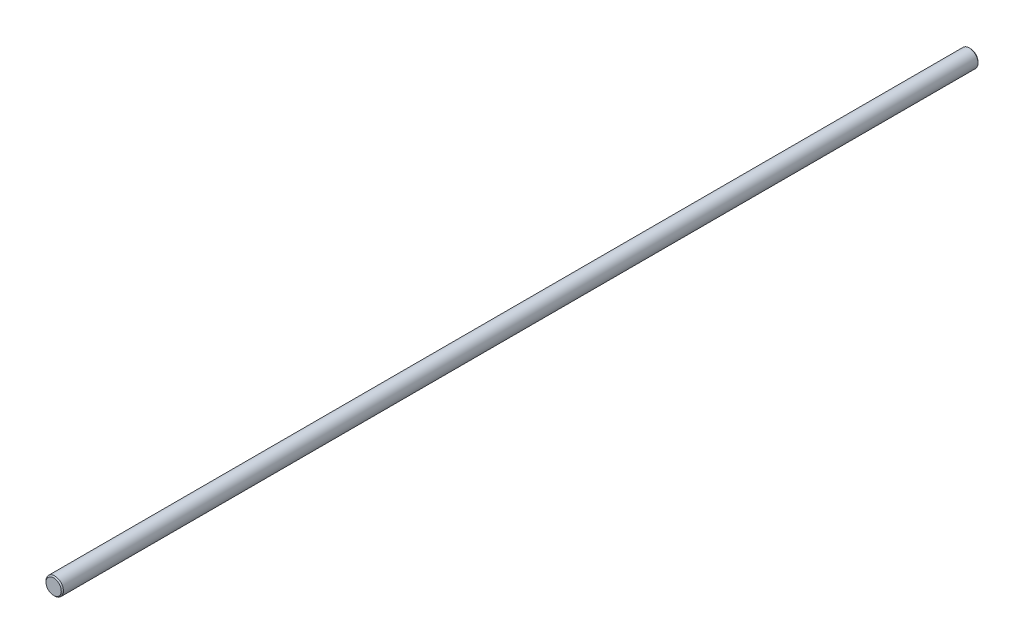
ISO-10303-21;
HEADER;
FILE_DESCRIPTION(('STEP AP214'),'2;1');
FILE_NAME('part.step','',(''),(''),'','','');
FILE_SCHEMA(('AUTOMOTIVE_DESIGN { 1 0 10303 214 1 1 1 1 }'));
ENDSEC;
DATA;
#1=APPLICATION_CONTEXT('core data for automotive mechanical design processes');
#2=APPLICATION_PROTOCOL_DEFINITION('international standard','automotive_design',2000,#1);
#3=PRODUCT_CONTEXT('',#1,'mechanical');
#4=PRODUCT('Part','Part','',(#3));
#5=PRODUCT_RELATED_PRODUCT_CATEGORY('part','',(#4));
#6=PRODUCT_DEFINITION_FORMATION('','',#4);
#7=PRODUCT_DEFINITION_CONTEXT('part definition',#1,'design');
#8=PRODUCT_DEFINITION('design','',#6,#7);
#9=PRODUCT_DEFINITION_SHAPE('','',#8);
#10=(LENGTH_UNIT() NAMED_UNIT(*) SI_UNIT(.MILLI.,.METRE.));
#11=(NAMED_UNIT(*) PLANE_ANGLE_UNIT() SI_UNIT($,.RADIAN.));
#12=(NAMED_UNIT(*) SI_UNIT($,.STERADIAN.) SOLID_ANGLE_UNIT());
#13=UNCERTAINTY_MEASURE_WITH_UNIT(LENGTH_MEASURE(1.E-05),#10,'distance_accuracy_value','');
#14=(GEOMETRIC_REPRESENTATION_CONTEXT(3) GLOBAL_UNCERTAINTY_ASSIGNED_CONTEXT((#13)) GLOBAL_UNIT_ASSIGNED_CONTEXT((#10,
#11,#12)) REPRESENTATION_CONTEXT('',''));
#15=CARTESIAN_POINT('',(0.,0.,0.));
#16=DIRECTION('',(0.,0.,1.));
#17=DIRECTION('',(1.,0.,0.));
#18=AXIS2_PLACEMENT_3D('',#15,#16,#17);
#19=CARTESIAN_POINT('',(0.,0.,420.));
#20=DIRECTION('',(0.,0.,-1.));
#21=DIRECTION('',(-1.,0.,0.));
#22=AXIS2_PLACEMENT_3D('',#19,#20,#21);
#23=CYLINDRICAL_SURFACE('',#22,4.);
#24=CARTESIAN_POINT('',(0.,0.,419.5));
#25=DIRECTION('',(0.,0.,1.));
#26=DIRECTION('',(1.,0.,0.));
#27=AXIS2_PLACEMENT_3D('',#24,#25,#26);
#28=CIRCLE('',#27,4.);
#29=CARTESIAN_POINT('',(4.,0.,419.5));
#30=VERTEX_POINT('',#29);
#31=EDGE_CURVE('E45',#30,#30,#28,.F.);
#32=ORIENTED_EDGE('',*,*,#31,.T.);
#33=EDGE_LOOP('',(#32));
#34=FACE_BOUND('',#33,.T.);
#35=CARTESIAN_POINT('',(0.,0.,0.500000000000111));
#36=DIRECTION('',(0.,0.,1.));
#37=DIRECTION('',(1.,0.,0.));
#38=AXIS2_PLACEMENT_3D('',#35,#36,#37);
#39=CIRCLE('',#38,4.);
#40=CARTESIAN_POINT('',(4.,0.,0.500000000000111));
#41=VERTEX_POINT('',#40);
#42=EDGE_CURVE('E50',#41,#41,#39,.T.);
#43=ORIENTED_EDGE('',*,*,#42,.T.);
#44=EDGE_LOOP('',(#43));
#45=FACE_BOUND('',#44,.T.);
#46=ADVANCED_FACE('F37',(#34,#45),#23,.T.);
#47=CARTESIAN_POINT('',(0.,0.,420.));
#48=DIRECTION('',(0.,0.,1.));
#49=DIRECTION('',(1.,0.,0.));
#50=AXIS2_PLACEMENT_3D('',#47,#48,#49);
#51=PLANE('',#50);
#52=CARTESIAN_POINT('',(0.,0.,420.));
#53=DIRECTION('',(0.,0.,1.));
#54=DIRECTION('',(1.,0.,0.));
#55=AXIS2_PLACEMENT_3D('',#52,#53,#54);
#56=CIRCLE('',#55,3.5);
#57=CARTESIAN_POINT('',(3.5,0.,420.));
#58=VERTEX_POINT('',#57);
#59=EDGE_CURVE('E55',#58,#58,#56,.T.);
#60=ORIENTED_EDGE('',*,*,#59,.T.);
#61=EDGE_LOOP('',(#60));
#62=FACE_BOUND('',#61,.T.);
#63=ADVANCED_FACE('F62',(#62),#51,.T.);
#64=CARTESIAN_POINT('',(0.,0.,0.));
#65=DIRECTION('',(0.,0.,1.));
#66=DIRECTION('',(1.,0.,0.));
#67=AXIS2_PLACEMENT_3D('',#64,#65,#66);
#68=PLANE('',#67);
#69=CARTESIAN_POINT('',(0.,0.,0.));
#70=DIRECTION('',(0.,0.,1.));
#71=DIRECTION('',(1.,0.,0.));
#72=AXIS2_PLACEMENT_3D('',#69,#70,#71);
#73=CIRCLE('',#72,3.49999999999995);
#74=CARTESIAN_POINT('',(3.49999999999995,0.,0.));
#75=VERTEX_POINT('',#74);
#76=EDGE_CURVE('E10',#75,#75,#73,.F.);
#77=ORIENTED_EDGE('',*,*,#76,.T.);
#78=EDGE_LOOP('',(#77));
#79=FACE_BOUND('',#78,.T.);
#80=ADVANCED_FACE('F66',(#79),#68,.F.);
#81=CARTESIAN_POINT('',(0.,0.,420.));
#82=DIRECTION('',(0.,0.,-1.));
#83=DIRECTION('',(-1.,0.,0.));
#84=AXIS2_PLACEMENT_3D('',#81,#82,#83);
#85=CONICAL_SURFACE('',#84,3.5,0.785398163397445);
#86=ORIENTED_EDGE('',*,*,#31,.F.);
#87=EDGE_LOOP('',(#86));
#88=FACE_BOUND('',#87,.T.);
#89=ORIENTED_EDGE('',*,*,#59,.F.);
#90=EDGE_LOOP('',(#89));
#91=FACE_BOUND('',#90,.T.);
#92=ADVANCED_FACE('F64',(#88,#91),#85,.T.);
#93=CARTESIAN_POINT('',(0.,0.,0.500000000000111));
#94=DIRECTION('',(0.,0.,1.));
#95=DIRECTION('',(1.,0.,0.));
#96=AXIS2_PLACEMENT_3D('',#93,#94,#95);
#97=CONICAL_SURFACE('',#96,4.,0.785398163397389);
#98=ORIENTED_EDGE('',*,*,#76,.F.);
#99=EDGE_LOOP('',(#98));
#100=FACE_BOUND('',#99,.T.);
#101=ORIENTED_EDGE('',*,*,#42,.F.);
#102=EDGE_LOOP('',(#101));
#103=FACE_BOUND('',#102,.T.);
#104=ADVANCED_FACE('F39',(#100,#103),#97,.T.);
#105=CLOSED_SHELL('',(#46,#63,#80,#92,#104));
#106=MANIFOLD_SOLID_BREP('B2',#105);
#107=ADVANCED_BREP_SHAPE_REPRESENTATION('',(#18,#106),#14);
#108=SHAPE_DEFINITION_REPRESENTATION(#9,#107);
ENDSEC;
END-ISO-10303-21;
